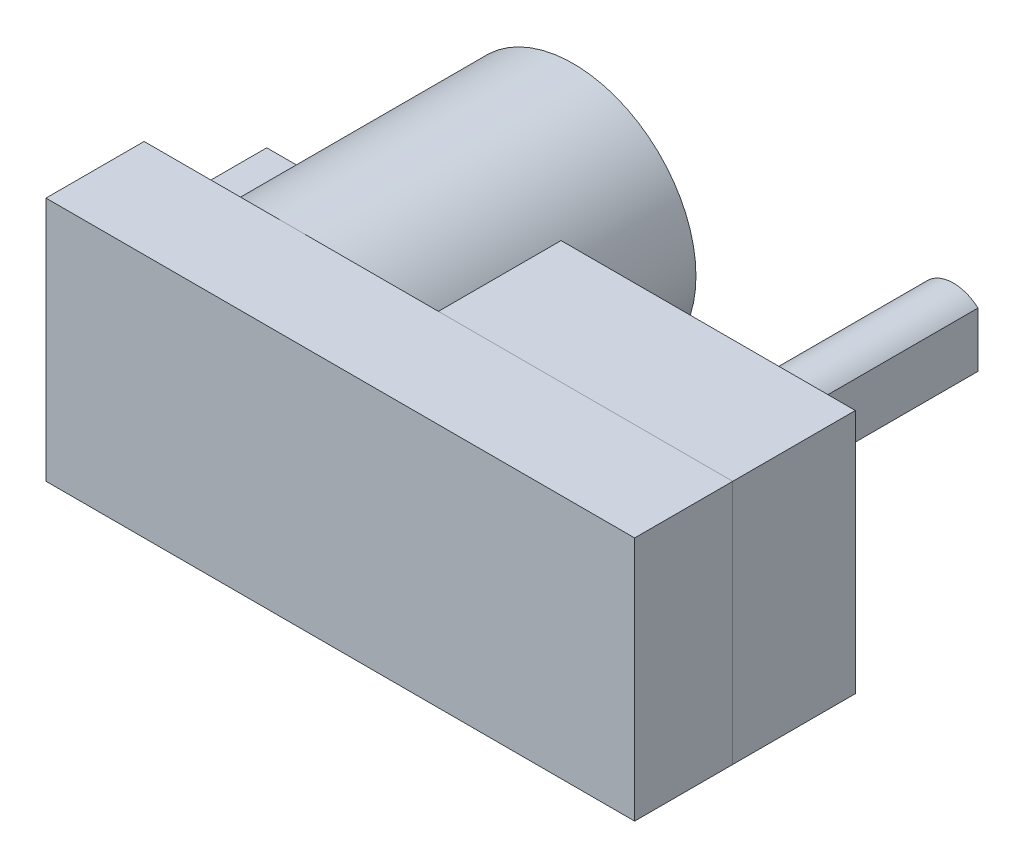
ISO-10303-21;
HEADER;
FILE_DESCRIPTION(('STEP AP214'),'2;1');
FILE_NAME('part.step','',(''),(''),'','','');
FILE_SCHEMA(('AUTOMOTIVE_DESIGN { 1 0 10303 214 1 1 1 1 }'));
ENDSEC;
DATA;
#1=APPLICATION_CONTEXT('core data for automotive mechanical design processes');
#2=APPLICATION_PROTOCOL_DEFINITION('international standard','automotive_design',2000,#1);
#3=PRODUCT_CONTEXT('',#1,'mechanical');
#4=PRODUCT('Part','Part','',(#3));
#5=PRODUCT_RELATED_PRODUCT_CATEGORY('part','',(#4));
#6=PRODUCT_DEFINITION_FORMATION('','',#4);
#7=PRODUCT_DEFINITION_CONTEXT('part definition',#1,'design');
#8=PRODUCT_DEFINITION('design','',#6,#7);
#9=PRODUCT_DEFINITION_SHAPE('','',#8);
#10=(LENGTH_UNIT() NAMED_UNIT(*) SI_UNIT(.MILLI.,.METRE.));
#11=(NAMED_UNIT(*) PLANE_ANGLE_UNIT() SI_UNIT($,.RADIAN.));
#12=(NAMED_UNIT(*) SI_UNIT($,.STERADIAN.) SOLID_ANGLE_UNIT());
#13=UNCERTAINTY_MEASURE_WITH_UNIT(LENGTH_MEASURE(1.E-05),#10,'distance_accuracy_value','');
#14=(GEOMETRIC_REPRESENTATION_CONTEXT(3) GLOBAL_UNCERTAINTY_ASSIGNED_CONTEXT((#13)) GLOBAL_UNIT_ASSIGNED_CONTEXT((#10,
#11,#12)) REPRESENTATION_CONTEXT('',''));
#15=CARTESIAN_POINT('',(0.,0.,0.));
#16=DIRECTION('',(0.,0.,1.));
#17=DIRECTION('',(1.,0.,0.));
#18=AXIS2_PLACEMENT_3D('',#15,#16,#17);
#19=CARTESIAN_POINT('',(0.,7.27643944298961,-9.));
#20=DIRECTION('',(0.,-1.,0.));
#21=DIRECTION('',(0.,0.,-1.));
#22=AXIS2_PLACEMENT_3D('',#19,#20,#21);
#23=PLANE('',#22);
#24=DIRECTION('',(1.,0.,0.));
#25=VECTOR('',#24,1.);
#26=CARTESIAN_POINT('',(0.,7.27643944298961,-4.));
#27=LINE('',#26,#25);
#28=CARTESIAN_POINT('',(0.,7.27643944298961,-4.));
#29=VERTEX_POINT('',#28);
#30=CARTESIAN_POINT('',(1.53555222378543,7.27643944298961,-4.));
#31=VERTEX_POINT('',#30);
#32=EDGE_CURVE('E115',#29,#31,#27,.T.);
#33=ORIENTED_EDGE('',*,*,#32,.T.);
#34=DIRECTION('',(0.,0.,1.));
#35=VECTOR('',#34,1.);
#36=CARTESIAN_POINT('',(1.53555222378543,7.27643944298961,-9.));
#37=LINE('',#36,#35);
#38=CARTESIAN_POINT('',(1.53555222378543,7.27643944298961,-9.));
#39=VERTEX_POINT('',#38);
#40=EDGE_CURVE('E12',#39,#31,#37,.T.);
#41=ORIENTED_EDGE('',*,*,#40,.F.);
#42=DIRECTION('',(1.,0.,0.));
#43=VECTOR('',#42,1.);
#44=CARTESIAN_POINT('',(0.,7.27643944298961,-9.));
#45=LINE('',#44,#43);
#46=CARTESIAN_POINT('',(0.,7.27643944298961,-9.));
#47=VERTEX_POINT('',#46);
#48=EDGE_CURVE('E92',#47,#39,#45,.T.);
#49=ORIENTED_EDGE('',*,*,#48,.F.);
#50=DIRECTION('',(0.,0.,1.));
#51=VECTOR('',#50,1.);
#52=CARTESIAN_POINT('',(0.,7.27643944298961,-9.));
#53=LINE('',#52,#51);
#54=EDGE_CURVE('E111',#47,#29,#53,.T.);
#55=ORIENTED_EDGE('',*,*,#54,.T.);
#56=EDGE_LOOP('',(#33,#41,#49,#55));
#57=FACE_BOUND('',#56,.T.);
#58=ADVANCED_FACE('F53',(#57),#23,.F.);
#59=CARTESIAN_POINT('',(1.53555222378543,2.15098793069046,-9.));
#60=DIRECTION('',(1.,0.,0.));
#61=DIRECTION('',(0.,0.,-1.));
#62=AXIS2_PLACEMENT_3D('',#59,#60,#61);
#63=PLANE('',#62);
#64=DIRECTION('',(0.,1.,0.));
#65=VECTOR('',#64,1.);
#66=CARTESIAN_POINT('',(1.53555222378543,2.15098793069046,-4.));
#67=LINE('',#66,#65);
#68=CARTESIAN_POINT('',(1.53555222378543,2.15098793069046,-4.));
#69=VERTEX_POINT('',#68);
#70=EDGE_CURVE('E101',#69,#31,#67,.T.);
#71=ORIENTED_EDGE('',*,*,#70,.F.);
#72=DIRECTION('',(0.,0.,1.));
#73=VECTOR('',#72,1.);
#74=CARTESIAN_POINT('',(1.53555222378543,2.15098793069046,-9.));
#75=LINE('',#74,#73);
#76=CARTESIAN_POINT('',(1.53555222378543,2.15098793069046,-9.));
#77=VERTEX_POINT('',#76);
#78=EDGE_CURVE('E61',#77,#69,#75,.T.);
#79=ORIENTED_EDGE('',*,*,#78,.F.);
#80=DIRECTION('',(0.,1.,0.));
#81=VECTOR('',#80,1.);
#82=CARTESIAN_POINT('',(1.53555222378543,2.15098793069046,-9.));
#83=LINE('',#82,#81);
#84=EDGE_CURVE('E99',#77,#39,#83,.T.);
#85=ORIENTED_EDGE('',*,*,#84,.T.);
#86=ORIENTED_EDGE('',*,*,#40,.T.);
#87=EDGE_LOOP('',(#71,#79,#85,#86));
#88=FACE_BOUND('',#87,.T.);
#89=ADVANCED_FACE('F98',(#88),#63,.T.);
#90=CARTESIAN_POINT('',(0.,2.15098793069046,-9.));
#91=DIRECTION('',(0.,-1.,0.));
#92=DIRECTION('',(0.,0.,-1.));
#93=AXIS2_PLACEMENT_3D('',#90,#91,#92);
#94=PLANE('',#93);
#95=DIRECTION('',(1.,0.,0.));
#96=VECTOR('',#95,1.);
#97=CARTESIAN_POINT('',(0.,2.15098793069046,-4.));
#98=LINE('',#97,#96);
#99=CARTESIAN_POINT('',(0.,2.15098793069046,-4.));
#100=VERTEX_POINT('',#99);
#101=EDGE_CURVE('E119',#100,#69,#98,.T.);
#102=ORIENTED_EDGE('',*,*,#101,.F.);
#103=DIRECTION('',(0.,0.,1.));
#104=VECTOR('',#103,1.);
#105=CARTESIAN_POINT('',(0.,2.15098793069046,-9.));
#106=LINE('',#105,#104);
#107=CARTESIAN_POINT('',(0.,2.15098793069046,-9.));
#108=VERTEX_POINT('',#107);
#109=EDGE_CURVE('E84',#108,#100,#106,.T.);
#110=ORIENTED_EDGE('',*,*,#109,.F.);
#111=DIRECTION('',(1.,0.,0.));
#112=VECTOR('',#111,1.);
#113=CARTESIAN_POINT('',(0.,2.15098793069046,-9.));
#114=LINE('',#113,#112);
#115=EDGE_CURVE('E107',#108,#77,#114,.T.);
#116=ORIENTED_EDGE('',*,*,#115,.T.);
#117=ORIENTED_EDGE('',*,*,#78,.T.);
#118=EDGE_LOOP('',(#102,#110,#116,#117));
#119=FACE_BOUND('',#118,.T.);
#120=ADVANCED_FACE('F109',(#119),#94,.T.);
#121=CARTESIAN_POINT('',(0.,2.15098793069046,-9.));
#122=DIRECTION('',(1.,0.,0.));
#123=DIRECTION('',(0.,0.,-1.));
#124=AXIS2_PLACEMENT_3D('',#121,#122,#123);
#125=PLANE('',#124);
#126=DIRECTION('',(0.,1.,0.));
#127=VECTOR('',#126,1.);
#128=CARTESIAN_POINT('',(0.,2.15098793069046,-4.));
#129=LINE('',#128,#127);
#130=EDGE_CURVE('E87',#100,#29,#129,.T.);
#131=ORIENTED_EDGE('',*,*,#130,.T.);
#132=ORIENTED_EDGE('',*,*,#54,.F.);
#133=DIRECTION('',(0.,1.,0.));
#134=VECTOR('',#133,1.);
#135=CARTESIAN_POINT('',(0.,2.15098793069046,-9.));
#136=LINE('',#135,#134);
#137=EDGE_CURVE('E69',#108,#47,#136,.T.);
#138=ORIENTED_EDGE('',*,*,#137,.F.);
#139=ORIENTED_EDGE('',*,*,#109,.T.);
#140=EDGE_LOOP('',(#131,#132,#138,#139));
#141=FACE_BOUND('',#140,.T.);
#142=ADVANCED_FACE('F132',(#141),#125,.F.);
#143=CARTESIAN_POINT('',(0.,0.,-9.));
#144=DIRECTION('',(0.,0.,1.));
#145=DIRECTION('',(1.,0.,0.));
#146=AXIS2_PLACEMENT_3D('',#143,#144,#145);
#147=PLANE('',#146);
#148=ORIENTED_EDGE('',*,*,#48,.T.);
#149=ORIENTED_EDGE('',*,*,#84,.F.);
#150=ORIENTED_EDGE('',*,*,#115,.F.);
#151=ORIENTED_EDGE('',*,*,#137,.T.);
#152=EDGE_LOOP('',(#148,#149,#150,#151));
#153=FACE_BOUND('',#152,.T.);
#154=ADVANCED_FACE('F106',(#153),#147,.F.);
#155=CARTESIAN_POINT('',(0.,0.,-4.));
#156=DIRECTION('',(0.,0.,1.));
#157=DIRECTION('',(1.,0.,0.));
#158=AXIS2_PLACEMENT_3D('',#155,#156,#157);
#159=PLANE('',#158);
#160=ORIENTED_EDGE('',*,*,#32,.F.);
#161=ORIENTED_EDGE('',*,*,#130,.F.);
#162=ORIENTED_EDGE('',*,*,#101,.T.);
#163=ORIENTED_EDGE('',*,*,#70,.T.);
#164=EDGE_LOOP('',(#160,#161,#162,#163));
#165=FACE_BOUND('',#164,.T.);
#166=ADVANCED_FACE('F126',(#165),#159,.T.);
#167=CLOSED_SHELL('',(#58,#89,#120,#142,#154,#166));
#168=MANIFOLD_SOLID_BREP('B2',#167);
#169=CARTESIAN_POINT('',(18.,5.,-19.));
#170=DIRECTION('',(0.,0.,1.));
#171=DIRECTION('',(1.,0.,0.));
#172=AXIS2_PLACEMENT_3D('',#169,#170,#171);
#173=CYLINDRICAL_SURFACE('',#172,1.5);
#174=CARTESIAN_POINT('',(18.,5.,-9.));
#175=DIRECTION('',(0.,0.,-1.));
#176=DIRECTION('',(-1.,0.,0.));
#177=AXIS2_PLACEMENT_3D('',#174,#175,#176);
#178=CIRCLE('',#177,1.5);
#179=CARTESIAN_POINT('',(16.5,5.,-9.));
#180=VERTEX_POINT('',#179);
#181=EDGE_CURVE('E189',#180,#180,#178,.T.);
#182=ORIENTED_EDGE('',*,*,#181,.T.);
#183=EDGE_LOOP('',(#182));
#184=FACE_BOUND('',#183,.T.);
#185=DIRECTION('',(0.,0.,1.));
#186=VECTOR('',#185,1.);
#187=CARTESIAN_POINT('',(19.,6.1180339887499,-83.0031054702616));
#188=LINE('',#187,#186);
#189=CARTESIAN_POINT('',(19.,6.1180339887499,-19.));
#190=VERTEX_POINT('',#189);
#191=CARTESIAN_POINT('',(19.,6.1180339887499,-10.));
#192=VERTEX_POINT('',#191);
#193=EDGE_CURVE('E216',#190,#192,#188,.T.);
#194=ORIENTED_EDGE('',*,*,#193,.F.);
#195=CARTESIAN_POINT('',(18.,5.,-19.));
#196=DIRECTION('',(0.,0.,-1.));
#197=DIRECTION('',(-1.,0.,0.));
#198=AXIS2_PLACEMENT_3D('',#195,#196,#197);
#199=CIRCLE('',#198,1.5);
#200=CARTESIAN_POINT('',(19.,3.88196601125011,-19.));
#201=VERTEX_POINT('',#200);
#202=EDGE_CURVE('E51',#201,#190,#199,.T.);
#203=ORIENTED_EDGE('',*,*,#202,.F.);
#204=DIRECTION('',(0.,0.,1.));
#205=VECTOR('',#204,1.);
#206=CARTESIAN_POINT('',(19.,3.88196601125011,-83.0031054702616));
#207=LINE('',#206,#205);
#208=CARTESIAN_POINT('',(19.,3.88196601125011,-10.));
#209=VERTEX_POINT('',#208);
#210=EDGE_CURVE('E200',#201,#209,#207,.T.);
#211=ORIENTED_EDGE('',*,*,#210,.T.);
#212=CARTESIAN_POINT('',(18.,5.,-10.));
#213=DIRECTION('',(0.,0.,-1.));
#214=DIRECTION('',(-1.,0.,0.));
#215=AXIS2_PLACEMENT_3D('',#212,#213,#214);
#216=CIRCLE('',#215,1.5);
#217=EDGE_CURVE('E215',#192,#209,#216,.T.);
#218=ORIENTED_EDGE('',*,*,#217,.F.);
#219=EDGE_LOOP('',(#194,#203,#211,#218));
#220=FACE_BOUND('',#219,.T.);
#221=ADVANCED_FACE('F186',(#184,#220),#173,.T.);
#222=CARTESIAN_POINT('',(0.,0.,-19.));
#223=DIRECTION('',(0.,0.,-1.));
#224=DIRECTION('',(-1.,0.,0.));
#225=AXIS2_PLACEMENT_3D('',#222,#223,#224);
#226=PLANE('',#225);
#227=ORIENTED_EDGE('',*,*,#202,.T.);
#228=DIRECTION('',(0.,1.,0.));
#229=VECTOR('',#228,1.);
#230=CARTESIAN_POINT('',(19.,3.88196601125011,-19.));
#231=LINE('',#230,#229);
#232=EDGE_CURVE('E204',#201,#190,#231,.T.);
#233=ORIENTED_EDGE('',*,*,#232,.F.);
#234=EDGE_LOOP('',(#227,#233));
#235=FACE_BOUND('',#234,.T.);
#236=ADVANCED_FACE('F231',(#235),#226,.T.);
#237=CARTESIAN_POINT('',(0.,0.,-9.));
#238=DIRECTION('',(0.,0.,-1.));
#239=DIRECTION('',(-1.,0.,0.));
#240=AXIS2_PLACEMENT_3D('',#237,#238,#239);
#241=PLANE('',#240);
#242=ORIENTED_EDGE('',*,*,#181,.F.);
#243=EDGE_LOOP('',(#242));
#244=FACE_BOUND('',#243,.T.);
#245=ADVANCED_FACE('F229',(#244),#241,.F.);
#246=CARTESIAN_POINT('',(19.,3.88196601125011,-83.0031054702616));
#247=DIRECTION('',(1.,0.,0.));
#248=DIRECTION('',(0.,0.,-1.));
#249=AXIS2_PLACEMENT_3D('',#246,#247,#248);
#250=PLANE('',#249);
#251=ORIENTED_EDGE('',*,*,#210,.F.);
#252=ORIENTED_EDGE('',*,*,#232,.T.);
#253=ORIENTED_EDGE('',*,*,#193,.T.);
#254=DIRECTION('',(0.,1.,0.));
#255=VECTOR('',#254,1.);
#256=CARTESIAN_POINT('',(19.,3.88196601125011,-10.));
#257=LINE('',#256,#255);
#258=EDGE_CURVE('E212',#209,#192,#257,.T.);
#259=ORIENTED_EDGE('',*,*,#258,.F.);
#260=EDGE_LOOP('',(#251,#252,#253,#259));
#261=FACE_BOUND('',#260,.T.);
#262=ADVANCED_FACE('F218',(#261),#250,.T.);
#263=CARTESIAN_POINT('',(0.,0.,-10.));
#264=DIRECTION('',(0.,0.,-1.));
#265=DIRECTION('',(-1.,0.,0.));
#266=AXIS2_PLACEMENT_3D('',#263,#264,#265);
#267=PLANE('',#266);
#268=ORIENTED_EDGE('',*,*,#258,.T.);
#269=ORIENTED_EDGE('',*,*,#217,.T.);
#270=EDGE_LOOP('',(#268,#269));
#271=FACE_BOUND('',#270,.T.);
#272=ADVANCED_FACE('F213',(#271),#267,.T.);
#273=CLOSED_SHELL('',(#221,#236,#245,#262,#272));
#274=MANIFOLD_SOLID_BREP('B6',#273);
#275=CARTESIAN_POINT('',(24.,10.,-9.));
#276=DIRECTION('',(-1.,0.,0.));
#277=DIRECTION('',(0.,0.,1.));
#278=AXIS2_PLACEMENT_3D('',#275,#276,#277);
#279=PLANE('',#278);
#280=DIRECTION('',(0.,-1.,0.));
#281=VECTOR('',#280,1.);
#282=CARTESIAN_POINT('',(24.,10.,-4.));
#283=LINE('',#282,#281);
#284=CARTESIAN_POINT('',(24.,10.,-4.));
#285=VERTEX_POINT('',#284);
#286=CARTESIAN_POINT('',(24.,0.,-4.));
#287=VERTEX_POINT('',#286);
#288=EDGE_CURVE('E343',#285,#287,#283,.T.);
#289=ORIENTED_EDGE('',*,*,#288,.T.);
#290=DIRECTION('',(0.,0.,1.));
#291=VECTOR('',#290,1.);
#292=CARTESIAN_POINT('',(24.,0.,-9.));
#293=LINE('',#292,#291);
#294=CARTESIAN_POINT('',(24.,0.,-9.));
#295=VERTEX_POINT('',#294);
#296=EDGE_CURVE('E184',#295,#287,#293,.T.);
#297=ORIENTED_EDGE('',*,*,#296,.F.);
#298=DIRECTION('',(0.,-1.,0.));
#299=VECTOR('',#298,1.);
#300=CARTESIAN_POINT('',(24.,10.,-9.));
#301=LINE('',#300,#299);
#302=CARTESIAN_POINT('',(24.,10.,-9.));
#303=VERTEX_POINT('',#302);
#304=EDGE_CURVE('E331',#303,#295,#301,.T.);
#305=ORIENTED_EDGE('',*,*,#304,.F.);
#306=DIRECTION('',(0.,0.,1.));
#307=VECTOR('',#306,1.);
#308=CARTESIAN_POINT('',(24.,10.,-9.));
#309=LINE('',#308,#307);
#310=EDGE_CURVE('E339',#303,#285,#309,.T.);
#311=ORIENTED_EDGE('',*,*,#310,.T.);
#312=EDGE_LOOP('',(#289,#297,#305,#311));
#313=FACE_BOUND('',#312,.T.);
#314=ADVANCED_FACE('F280',(#313),#279,.F.);
#315=CARTESIAN_POINT('',(24.,0.,-9.));
#316=DIRECTION('',(0.,1.,0.));
#317=DIRECTION('',(0.,0.,1.));
#318=AXIS2_PLACEMENT_3D('',#315,#316,#317);
#319=PLANE('',#318);
#320=DIRECTION('',(-1.,0.,0.));
#321=VECTOR('',#320,1.);
#322=CARTESIAN_POINT('',(24.,0.,-4.));
#323=LINE('',#322,#321);
#324=CARTESIAN_POINT('',(12.,0.,-4.));
#325=VERTEX_POINT('',#324);
#326=EDGE_CURVE('E335',#287,#325,#323,.T.);
#327=ORIENTED_EDGE('',*,*,#326,.T.);
#328=DIRECTION('',(0.,0.,1.));
#329=VECTOR('',#328,1.);
#330=CARTESIAN_POINT('',(12.,0.,-9.));
#331=LINE('',#330,#329);
#332=CARTESIAN_POINT('',(12.,0.,-9.));
#333=VERTEX_POINT('',#332);
#334=EDGE_CURVE('E288',#333,#325,#331,.T.);
#335=ORIENTED_EDGE('',*,*,#334,.F.);
#336=DIRECTION('',(-1.,0.,0.));
#337=VECTOR('',#336,1.);
#338=CARTESIAN_POINT('',(24.,0.,-9.));
#339=LINE('',#338,#337);
#340=EDGE_CURVE('E326',#295,#333,#339,.T.);
#341=ORIENTED_EDGE('',*,*,#340,.F.);
#342=ORIENTED_EDGE('',*,*,#296,.T.);
#343=EDGE_LOOP('',(#327,#335,#341,#342));
#344=FACE_BOUND('',#343,.T.);
#345=ADVANCED_FACE('F334',(#344),#319,.F.);
#346=CARTESIAN_POINT('',(12.,10.,-9.));
#347=DIRECTION('',(1.,0.,0.));
#348=DIRECTION('',(0.,0.,-1.));
#349=AXIS2_PLACEMENT_3D('',#346,#347,#348);
#350=PLANE('',#349);
#351=DIRECTION('',(0.,1.,0.));
#352=VECTOR('',#351,1.);
#353=CARTESIAN_POINT('',(12.,10.,-4.));
#354=LINE('',#353,#352);
#355=CARTESIAN_POINT('',(12.,10.,-4.));
#356=VERTEX_POINT('',#355);
#357=EDGE_CURVE('E313',#325,#356,#354,.T.);
#358=ORIENTED_EDGE('',*,*,#357,.T.);
#359=DIRECTION('',(0.,0.,1.));
#360=VECTOR('',#359,1.);
#361=CARTESIAN_POINT('',(12.,10.,-9.));
#362=LINE('',#361,#360);
#363=CARTESIAN_POINT('',(12.,10.,-9.));
#364=VERTEX_POINT('',#363);
#365=EDGE_CURVE('E336',#364,#356,#362,.T.);
#366=ORIENTED_EDGE('',*,*,#365,.F.);
#367=DIRECTION('',(0.,1.,0.));
#368=VECTOR('',#367,1.);
#369=CARTESIAN_POINT('',(12.,10.,-9.));
#370=LINE('',#369,#368);
#371=EDGE_CURVE('E329',#333,#364,#370,.T.);
#372=ORIENTED_EDGE('',*,*,#371,.F.);
#373=ORIENTED_EDGE('',*,*,#334,.T.);
#374=EDGE_LOOP('',(#358,#366,#372,#373));
#375=FACE_BOUND('',#374,.T.);
#376=ADVANCED_FACE('F337',(#375),#350,.F.);
#377=CARTESIAN_POINT('',(24.,10.,-9.));
#378=DIRECTION('',(0.,-1.,0.));
#379=DIRECTION('',(0.,0.,-1.));
#380=AXIS2_PLACEMENT_3D('',#377,#378,#379);
#381=PLANE('',#380);
#382=DIRECTION('',(1.,0.,0.));
#383=VECTOR('',#382,1.);
#384=CARTESIAN_POINT('',(24.,10.,-4.));
#385=LINE('',#384,#383);
#386=EDGE_CURVE('E319',#356,#285,#385,.T.);
#387=ORIENTED_EDGE('',*,*,#386,.T.);
#388=ORIENTED_EDGE('',*,*,#310,.F.);
#389=DIRECTION('',(1.,0.,0.));
#390=VECTOR('',#389,1.);
#391=CARTESIAN_POINT('',(24.,10.,-9.));
#392=LINE('',#391,#390);
#393=EDGE_CURVE('E296',#364,#303,#392,.T.);
#394=ORIENTED_EDGE('',*,*,#393,.F.);
#395=ORIENTED_EDGE('',*,*,#365,.T.);
#396=EDGE_LOOP('',(#387,#388,#394,#395));
#397=FACE_BOUND('',#396,.T.);
#398=ADVANCED_FACE('F351',(#397),#381,.F.);
#399=CARTESIAN_POINT('',(0.,0.,-9.));
#400=DIRECTION('',(0.,0.,-1.));
#401=DIRECTION('',(-1.,0.,0.));
#402=AXIS2_PLACEMENT_3D('',#399,#400,#401);
#403=PLANE('',#402);
#404=CARTESIAN_POINT('',(22.5,5.,-9.));
#405=DIRECTION('',(0.,0.,-1.));
#406=DIRECTION('',(-1.,0.,0.));
#407=AXIS2_PLACEMENT_3D('',#404,#405,#406);
#408=CIRCLE('',#407,0.625000000000001);
#409=CARTESIAN_POINT('',(21.875,5.,-9.));
#410=VERTEX_POINT('',#409);
#411=EDGE_CURVE('E365',#410,#410,#408,.T.);
#412=ORIENTED_EDGE('',*,*,#411,.F.);
#413=EDGE_LOOP('',(#412));
#414=FACE_BOUND('',#413,.T.);
#415=CARTESIAN_POINT('',(13.5,5.,-9.));
#416=DIRECTION('',(0.,0.,-1.));
#417=DIRECTION('',(-1.,0.,0.));
#418=AXIS2_PLACEMENT_3D('',#415,#416,#417);
#419=CIRCLE('',#418,0.625000000000001);
#420=CARTESIAN_POINT('',(12.875,5.,-9.));
#421=VERTEX_POINT('',#420);
#422=EDGE_CURVE('E359',#421,#421,#419,.T.);
#423=ORIENTED_EDGE('',*,*,#422,.F.);
#424=EDGE_LOOP('',(#423));
#425=FACE_BOUND('',#424,.T.);
#426=ORIENTED_EDGE('',*,*,#304,.T.);
#427=ORIENTED_EDGE('',*,*,#340,.T.);
#428=ORIENTED_EDGE('',*,*,#371,.T.);
#429=ORIENTED_EDGE('',*,*,#393,.T.);
#430=EDGE_LOOP('',(#426,#427,#428,#429));
#431=FACE_BOUND('',#430,.T.);
#432=ADVANCED_FACE('F327',(#414,#425,#431),#403,.T.);
#433=CARTESIAN_POINT('',(0.,0.,-4.));
#434=DIRECTION('',(0.,0.,-1.));
#435=DIRECTION('',(-1.,0.,0.));
#436=AXIS2_PLACEMENT_3D('',#433,#434,#435);
#437=PLANE('',#436);
#438=CARTESIAN_POINT('',(22.5,5.,-4.));
#439=DIRECTION('',(0.,0.,-1.));
#440=DIRECTION('',(-1.,0.,0.));
#441=AXIS2_PLACEMENT_3D('',#438,#439,#440);
#442=CIRCLE('',#441,0.624999999999999);
#443=CARTESIAN_POINT('',(21.875,5.,-4.));
#444=VERTEX_POINT('',#443);
#445=EDGE_CURVE('E362',#444,#444,#442,.T.);
#446=ORIENTED_EDGE('',*,*,#445,.T.);
#447=EDGE_LOOP('',(#446));
#448=FACE_BOUND('',#447,.T.);
#449=CARTESIAN_POINT('',(13.5,5.,-4.));
#450=DIRECTION('',(0.,0.,-1.));
#451=DIRECTION('',(-1.,0.,0.));
#452=AXIS2_PLACEMENT_3D('',#449,#450,#451);
#453=CIRCLE('',#452,0.625);
#454=CARTESIAN_POINT('',(12.875,5.,-4.));
#455=VERTEX_POINT('',#454);
#456=EDGE_CURVE('E346',#455,#455,#453,.T.);
#457=ORIENTED_EDGE('',*,*,#456,.T.);
#458=EDGE_LOOP('',(#457));
#459=FACE_BOUND('',#458,.T.);
#460=ORIENTED_EDGE('',*,*,#288,.F.);
#461=ORIENTED_EDGE('',*,*,#386,.F.);
#462=ORIENTED_EDGE('',*,*,#357,.F.);
#463=ORIENTED_EDGE('',*,*,#326,.F.);
#464=EDGE_LOOP('',(#460,#461,#462,#463));
#465=FACE_BOUND('',#464,.T.);
#466=ADVANCED_FACE('F354',(#448,#459,#465),#437,.F.);
#467=CARTESIAN_POINT('',(13.5,5.,-9.));
#468=DIRECTION('',(0.,0.,-1.));
#469=DIRECTION('',(-1.,0.,0.));
#470=AXIS2_PLACEMENT_3D('',#467,#468,#469);
#471=CYLINDRICAL_SURFACE('',#470,0.625);
#472=ORIENTED_EDGE('',*,*,#456,.F.);
#473=EDGE_LOOP('',(#472));
#474=FACE_BOUND('',#473,.T.);
#475=ORIENTED_EDGE('',*,*,#422,.T.);
#476=EDGE_LOOP('',(#475));
#477=FACE_BOUND('',#476,.T.);
#478=ADVANCED_FACE('F376',(#474,#477),#471,.F.);
#479=CARTESIAN_POINT('',(22.5,5.,-9.));
#480=DIRECTION('',(0.,0.,-1.));
#481=DIRECTION('',(-1.,0.,0.));
#482=AXIS2_PLACEMENT_3D('',#479,#480,#481);
#483=CYLINDRICAL_SURFACE('',#482,0.624999999999999);
#484=ORIENTED_EDGE('',*,*,#445,.F.);
#485=EDGE_LOOP('',(#484));
#486=FACE_BOUND('',#485,.T.);
#487=ORIENTED_EDGE('',*,*,#411,.T.);
#488=EDGE_LOOP('',(#487));
#489=FACE_BOUND('',#488,.T.);
#490=ADVANCED_FACE('F369',(#486,#489),#483,.F.);
#491=CLOSED_SHELL('',(#314,#345,#376,#398,#432,#466,#478,#490));
#492=MANIFOLD_SOLID_BREP('B45',#491);
#493=CARTESIAN_POINT('',(6.,5.,-15.5));
#494=DIRECTION('',(0.,0.,1.));
#495=DIRECTION('',(1.,0.,0.));
#496=AXIS2_PLACEMENT_3D('',#493,#494,#495);
#497=CYLINDRICAL_SURFACE('',#496,5.);
#498=CARTESIAN_POINT('',(6.,5.,-15.5));
#499=DIRECTION('',(0.,0.,-1.));
#500=DIRECTION('',(-1.,0.,0.));
#501=AXIS2_PLACEMENT_3D('',#498,#499,#500);
#502=CIRCLE('',#501,5.);
#503=CARTESIAN_POINT('',(0.999999999999998,5.,-15.5));
#504=VERTEX_POINT('',#503);
#505=EDGE_CURVE('E465',#504,#504,#502,.T.);
#506=ORIENTED_EDGE('',*,*,#505,.F.);
#507=EDGE_LOOP('',(#506));
#508=FACE_BOUND('',#507,.T.);
#509=CARTESIAN_POINT('',(6.,5.,-4.));
#510=DIRECTION('',(0.,0.,-1.));
#511=DIRECTION('',(-1.,0.,0.));
#512=AXIS2_PLACEMENT_3D('',#509,#510,#511);
#513=CIRCLE('',#512,5.);
#514=CARTESIAN_POINT('',(0.999999999999998,5.,-4.));
#515=VERTEX_POINT('',#514);
#516=EDGE_CURVE('E461',#515,#515,#513,.T.);
#517=ORIENTED_EDGE('',*,*,#516,.T.);
#518=EDGE_LOOP('',(#517));
#519=FACE_BOUND('',#518,.T.);
#520=ADVANCED_FACE('F458',(#508,#519),#497,.T.);
#521=CARTESIAN_POINT('',(6.,5.,-15.5));
#522=DIRECTION('',(0.,0.,-1.));
#523=DIRECTION('',(-1.,0.,0.));
#524=AXIS2_PLACEMENT_3D('',#521,#522,#523);
#525=PLANE('',#524);
#526=CARTESIAN_POINT('',(6.0560567624961,4.51584889222545,-15.5));
#527=DIRECTION('',(0.,0.,-1.));
#528=DIRECTION('',(-1.,0.,0.));
#529=AXIS2_PLACEMENT_3D('',#526,#527,#528);
#530=CIRCLE('',#529,1.22370081126123);
#531=CARTESIAN_POINT('',(4.83235595123487,4.51584889222545,-15.5));
#532=VERTEX_POINT('',#531);
#533=EDGE_CURVE('E279',#532,#532,#530,.T.);
#534=ORIENTED_EDGE('',*,*,#533,.F.);
#535=EDGE_LOOP('',(#534));
#536=FACE_BOUND('',#535,.T.);
#537=ORIENTED_EDGE('',*,*,#505,.T.);
#538=EDGE_LOOP('',(#537));
#539=FACE_BOUND('',#538,.T.);
#540=ADVANCED_FACE('F482',(#536,#539),#525,.T.);
#541=CARTESIAN_POINT('',(6.,5.,-4.));
#542=DIRECTION('',(0.,0.,-1.));
#543=DIRECTION('',(-1.,0.,0.));
#544=AXIS2_PLACEMENT_3D('',#541,#542,#543);
#545=PLANE('',#544);
#546=ORIENTED_EDGE('',*,*,#516,.F.);
#547=EDGE_LOOP('',(#546));
#548=FACE_BOUND('',#547,.T.);
#549=ADVANCED_FACE('F479',(#548),#545,.F.);
#550=CARTESIAN_POINT('',(6.0560567624961,4.51584889222545,-16.5));
#551=DIRECTION('',(0.,0.,1.));
#552=DIRECTION('',(1.,0.,0.));
#553=AXIS2_PLACEMENT_3D('',#550,#551,#552);
#554=CYLINDRICAL_SURFACE('',#553,1.22370081126123);
#555=CARTESIAN_POINT('',(6.0560567624961,4.51584889222545,-16.5));
#556=DIRECTION('',(0.,0.,-1.));
#557=DIRECTION('',(-1.,0.,0.));
#558=AXIS2_PLACEMENT_3D('',#555,#556,#557);
#559=CIRCLE('',#558,1.22370081126123);
#560=CARTESIAN_POINT('',(4.83235595123487,4.51584889222545,-16.5));
#561=VERTEX_POINT('',#560);
#562=EDGE_CURVE('E471',#561,#561,#559,.T.);
#563=ORIENTED_EDGE('',*,*,#562,.F.);
#564=EDGE_LOOP('',(#563));
#565=FACE_BOUND('',#564,.T.);
#566=ORIENTED_EDGE('',*,*,#533,.T.);
#567=EDGE_LOOP('',(#566));
#568=FACE_BOUND('',#567,.T.);
#569=ADVANCED_FACE('F481',(#565,#568),#554,.T.);
#570=CARTESIAN_POINT('',(6.0560567624961,4.51584889222545,-16.5));
#571=DIRECTION('',(0.,0.,-1.));
#572=DIRECTION('',(-1.,0.,0.));
#573=AXIS2_PLACEMENT_3D('',#570,#571,#572);
#574=PLANE('',#573);
#575=ORIENTED_EDGE('',*,*,#562,.T.);
#576=EDGE_LOOP('',(#575));
#577=FACE_BOUND('',#576,.T.);
#578=ADVANCED_FACE('F487',(#577),#574,.T.);
#579=CLOSED_SHELL('',(#520,#540,#549,#569,#578));
#580=MANIFOLD_SOLID_BREP('B178',#579);
#581=CARTESIAN_POINT('',(0.,0.,-4.));
#582=DIRECTION('',(-1.,0.,0.));
#583=DIRECTION('',(0.,0.,1.));
#584=AXIS2_PLACEMENT_3D('',#581,#582,#583);
#585=PLANE('',#584);
#586=DIRECTION('',(0.,-1.,0.));
#587=VECTOR('',#586,1.);
#588=CARTESIAN_POINT('',(0.,0.,0.));
#589=LINE('',#588,#587);
#590=CARTESIAN_POINT('',(0.,10.,0.));
#591=VERTEX_POINT('',#590);
#592=CARTESIAN_POINT('',(0.,0.,0.));
#593=VERTEX_POINT('',#592);
#594=EDGE_CURVE('E601',#591,#593,#589,.T.);
#595=ORIENTED_EDGE('',*,*,#594,.F.);
#596=DIRECTION('',(0.,0.,1.));
#597=VECTOR('',#596,1.);
#598=CARTESIAN_POINT('',(0.,10.,-4.));
#599=LINE('',#598,#597);
#600=CARTESIAN_POINT('',(0.,10.,-4.));
#601=VERTEX_POINT('',#600);
#602=EDGE_CURVE('E456',#601,#591,#599,.T.);
#603=ORIENTED_EDGE('',*,*,#602,.F.);
#604=DIRECTION('',(0.,-1.,0.));
#605=VECTOR('',#604,1.);
#606=CARTESIAN_POINT('',(0.,0.,-4.));
#607=LINE('',#606,#605);
#608=CARTESIAN_POINT('',(0.,0.,-4.));
#609=VERTEX_POINT('',#608);
#610=EDGE_CURVE('E592',#601,#609,#607,.T.);
#611=ORIENTED_EDGE('',*,*,#610,.T.);
#612=DIRECTION('',(0.,0.,1.));
#613=VECTOR('',#612,1.);
#614=CARTESIAN_POINT('',(0.,0.,-4.));
#615=LINE('',#614,#613);
#616=EDGE_CURVE('E572',#609,#593,#615,.T.);
#617=ORIENTED_EDGE('',*,*,#616,.T.);
#618=EDGE_LOOP('',(#595,#603,#611,#617));
#619=FACE_BOUND('',#618,.T.);
#620=ADVANCED_FACE('F528',(#619),#585,.T.);
#621=CARTESIAN_POINT('',(0.,10.,-4.));
#622=DIRECTION('',(0.,1.,0.));
#623=DIRECTION('',(0.,0.,1.));
#624=AXIS2_PLACEMENT_3D('',#621,#622,#623);
#625=PLANE('',#624);
#626=DIRECTION('',(-1.,0.,0.));
#627=VECTOR('',#626,1.);
#628=CARTESIAN_POINT('',(0.,10.,0.));
#629=LINE('',#628,#627);
#630=CARTESIAN_POINT('',(24.,10.,0.));
#631=VERTEX_POINT('',#630);
#632=EDGE_CURVE('E595',#631,#591,#629,.T.);
#633=ORIENTED_EDGE('',*,*,#632,.F.);
#634=DIRECTION('',(0.,0.,1.));
#635=VECTOR('',#634,1.);
#636=CARTESIAN_POINT('',(24.,10.,-4.));
#637=LINE('',#636,#635);
#638=CARTESIAN_POINT('',(24.,10.,-4.));
#639=VERTEX_POINT('',#638);
#640=EDGE_CURVE('E538',#639,#631,#637,.T.);
#641=ORIENTED_EDGE('',*,*,#640,.F.);
#642=DIRECTION('',(-1.,0.,0.));
#643=VECTOR('',#642,1.);
#644=CARTESIAN_POINT('',(0.,10.,-4.));
#645=LINE('',#644,#643);
#646=EDGE_CURVE('E587',#639,#601,#645,.T.);
#647=ORIENTED_EDGE('',*,*,#646,.T.);
#648=ORIENTED_EDGE('',*,*,#602,.T.);
#649=EDGE_LOOP('',(#633,#641,#647,#648));
#650=FACE_BOUND('',#649,.T.);
#651=ADVANCED_FACE('F646',(#650),#625,.T.);
#652=CARTESIAN_POINT('',(24.,0.,-4.));
#653=DIRECTION('',(1.,0.,0.));
#654=DIRECTION('',(0.,0.,-1.));
#655=AXIS2_PLACEMENT_3D('',#652,#653,#654);
#656=PLANE('',#655);
#657=DIRECTION('',(0.,1.,0.));
#658=VECTOR('',#657,1.);
#659=CARTESIAN_POINT('',(24.,0.,0.));
#660=LINE('',#659,#658);
#661=CARTESIAN_POINT('',(24.,0.,0.));
#662=VERTEX_POINT('',#661);
#663=EDGE_CURVE('E580',#662,#631,#660,.T.);
#664=ORIENTED_EDGE('',*,*,#663,.F.);
#665=DIRECTION('',(0.,0.,1.));
#666=VECTOR('',#665,1.);
#667=CARTESIAN_POINT('',(24.,0.,-4.));
#668=LINE('',#667,#666);
#669=CARTESIAN_POINT('',(24.,0.,-4.));
#670=VERTEX_POINT('',#669);
#671=EDGE_CURVE('E575',#670,#662,#668,.T.);
#672=ORIENTED_EDGE('',*,*,#671,.F.);
#673=DIRECTION('',(0.,1.,0.));
#674=VECTOR('',#673,1.);
#675=CARTESIAN_POINT('',(24.,0.,-4.));
#676=LINE('',#675,#674);
#677=EDGE_CURVE('E578',#670,#639,#676,.T.);
#678=ORIENTED_EDGE('',*,*,#677,.T.);
#679=ORIENTED_EDGE('',*,*,#640,.T.);
#680=EDGE_LOOP('',(#664,#672,#678,#679));
#681=FACE_BOUND('',#680,.T.);
#682=ADVANCED_FACE('F577',(#681),#656,.T.);
#683=CARTESIAN_POINT('',(0.,0.,-4.));
#684=DIRECTION('',(0.,-1.,0.));
#685=DIRECTION('',(0.,0.,-1.));
#686=AXIS2_PLACEMENT_3D('',#683,#684,#685);
#687=PLANE('',#686);
#688=DIRECTION('',(1.,0.,0.));
#689=VECTOR('',#688,1.);
#690=CARTESIAN_POINT('',(0.,0.,0.));
#691=LINE('',#690,#689);
#692=EDGE_CURVE('E605',#593,#662,#691,.T.);
#693=ORIENTED_EDGE('',*,*,#692,.F.);
#694=ORIENTED_EDGE('',*,*,#616,.F.);
#695=DIRECTION('',(1.,0.,0.));
#696=VECTOR('',#695,1.);
#697=CARTESIAN_POINT('',(0.,0.,-4.));
#698=LINE('',#697,#696);
#699=EDGE_CURVE('E586',#609,#670,#698,.T.);
#700=ORIENTED_EDGE('',*,*,#699,.T.);
#701=ORIENTED_EDGE('',*,*,#671,.T.);
#702=EDGE_LOOP('',(#693,#694,#700,#701));
#703=FACE_BOUND('',#702,.T.);
#704=ADVANCED_FACE('F590',(#703),#687,.T.);
#705=CARTESIAN_POINT('',(0.,0.,-4.));
#706=DIRECTION('',(0.,0.,-1.));
#707=DIRECTION('',(-1.,0.,0.));
#708=AXIS2_PLACEMENT_3D('',#705,#706,#707);
#709=PLANE('',#708);
#710=CARTESIAN_POINT('',(22.5,5.,-4.));
#711=DIRECTION('',(0.,0.,-1.));
#712=DIRECTION('',(-1.,0.,0.));
#713=AXIS2_PLACEMENT_3D('',#710,#711,#712);
#714=CIRCLE('',#713,0.624999999999999);
#715=CARTESIAN_POINT('',(21.875,5.,-4.));
#716=VERTEX_POINT('',#715);
#717=EDGE_CURVE('E531',#716,#716,#714,.T.);
#718=ORIENTED_EDGE('',*,*,#717,.F.);
#719=EDGE_LOOP('',(#718));
#720=FACE_BOUND('',#719,.T.);
#721=CARTESIAN_POINT('',(13.5,5.,-4.));
#722=DIRECTION('',(0.,0.,-1.));
#723=DIRECTION('',(-1.,0.,0.));
#724=AXIS2_PLACEMENT_3D('',#721,#722,#723);
#725=CIRCLE('',#724,0.625);
#726=CARTESIAN_POINT('',(12.875,5.,-4.));
#727=VERTEX_POINT('',#726);
#728=EDGE_CURVE('E606',#727,#727,#725,.T.);
#729=ORIENTED_EDGE('',*,*,#728,.F.);
#730=EDGE_LOOP('',(#729));
#731=FACE_BOUND('',#730,.T.);
#732=ORIENTED_EDGE('',*,*,#610,.F.);
#733=ORIENTED_EDGE('',*,*,#646,.F.);
#734=ORIENTED_EDGE('',*,*,#677,.F.);
#735=ORIENTED_EDGE('',*,*,#699,.F.);
#736=EDGE_LOOP('',(#732,#733,#734,#735));
#737=FACE_BOUND('',#736,.T.);
#738=ADVANCED_FACE('F585',(#720,#731,#737),#709,.T.);
#739=CARTESIAN_POINT('',(0.,0.,0.));
#740=DIRECTION('',(0.,0.,-1.));
#741=DIRECTION('',(-1.,0.,0.));
#742=AXIS2_PLACEMENT_3D('',#739,#740,#741);
#743=PLANE('',#742);
#744=ORIENTED_EDGE('',*,*,#594,.T.);
#745=ORIENTED_EDGE('',*,*,#692,.T.);
#746=ORIENTED_EDGE('',*,*,#663,.T.);
#747=ORIENTED_EDGE('',*,*,#632,.T.);
#748=EDGE_LOOP('',(#744,#745,#746,#747));
#749=FACE_BOUND('',#748,.T.);
#750=ADVANCED_FACE('F652',(#749),#743,.F.);
#751=CARTESIAN_POINT('',(13.5,5.,-3.999));
#752=DIRECTION('',(0.,0.,1.));
#753=DIRECTION('',(1.,0.,0.));
#754=AXIS2_PLACEMENT_3D('',#751,#752,#753);
#755=PLANE('',#754);
#756=CARTESIAN_POINT('',(13.5,5.,-3.999));
#757=DIRECTION('',(0.,0.,-1.));
#758=DIRECTION('',(-1.,0.,0.));
#759=AXIS2_PLACEMENT_3D('',#756,#757,#758);
#760=CIRCLE('',#759,0.624999999999999);
#761=CARTESIAN_POINT('',(12.875,5.,-3.999));
#762=VERTEX_POINT('',#761);
#763=EDGE_CURVE('E619',#762,#762,#760,.T.);
#764=ORIENTED_EDGE('',*,*,#763,.T.);
#765=EDGE_LOOP('',(#764));
#766=FACE_BOUND('',#765,.T.);
#767=ADVANCED_FACE('F654',(#766),#755,.F.);
#768=CARTESIAN_POINT('',(13.5,5.,-9.));
#769=DIRECTION('',(0.,0.,-1.));
#770=DIRECTION('',(-1.,0.,0.));
#771=AXIS2_PLACEMENT_3D('',#768,#769,#770);
#772=CYLINDRICAL_SURFACE('',#771,0.625);
#773=ORIENTED_EDGE('',*,*,#728,.T.);
#774=EDGE_LOOP('',(#773));
#775=FACE_BOUND('',#774,.T.);
#776=ORIENTED_EDGE('',*,*,#763,.F.);
#777=EDGE_LOOP('',(#776));
#778=FACE_BOUND('',#777,.T.);
#779=ADVANCED_FACE('F643',(#775,#778),#772,.F.);
#780=CARTESIAN_POINT('',(22.5,5.,-3.999));
#781=DIRECTION('',(0.,0.,1.));
#782=DIRECTION('',(1.,0.,0.));
#783=AXIS2_PLACEMENT_3D('',#780,#781,#782);
#784=PLANE('',#783);
#785=CARTESIAN_POINT('',(22.5,5.,-3.999));
#786=DIRECTION('',(0.,0.,-1.));
#787=DIRECTION('',(-1.,0.,0.));
#788=AXIS2_PLACEMENT_3D('',#785,#786,#787);
#789=CIRCLE('',#788,0.624999999999997);
#790=CARTESIAN_POINT('',(21.875,5.,-3.999));
#791=VERTEX_POINT('',#790);
#792=EDGE_CURVE('E628',#791,#791,#789,.T.);
#793=ORIENTED_EDGE('',*,*,#792,.T.);
#794=EDGE_LOOP('',(#793));
#795=FACE_BOUND('',#794,.T.);
#796=ADVANCED_FACE('F634',(#795),#784,.F.);
#797=CARTESIAN_POINT('',(22.5,5.,-9.));
#798=DIRECTION('',(0.,0.,-1.));
#799=DIRECTION('',(-1.,0.,0.));
#800=AXIS2_PLACEMENT_3D('',#797,#798,#799);
#801=CYLINDRICAL_SURFACE('',#800,0.624999999999999);
#802=ORIENTED_EDGE('',*,*,#717,.T.);
#803=EDGE_LOOP('',(#802));
#804=FACE_BOUND('',#803,.T.);
#805=ORIENTED_EDGE('',*,*,#792,.F.);
#806=EDGE_LOOP('',(#805));
#807=FACE_BOUND('',#806,.T.);
#808=ADVANCED_FACE('F636',(#804,#807),#801,.F.);
#809=CLOSED_SHELL('',(#620,#651,#682,#704,#738,#750,#767,#779,#796,#808));
#810=MANIFOLD_SOLID_BREP('B274',#809);
#811=ADVANCED_BREP_SHAPE_REPRESENTATION('',(#18,#168,#274,#492,#580,#810),#14);
#812=SHAPE_DEFINITION_REPRESENTATION(#9,#811);
ENDSEC;
END-ISO-10303-21;
